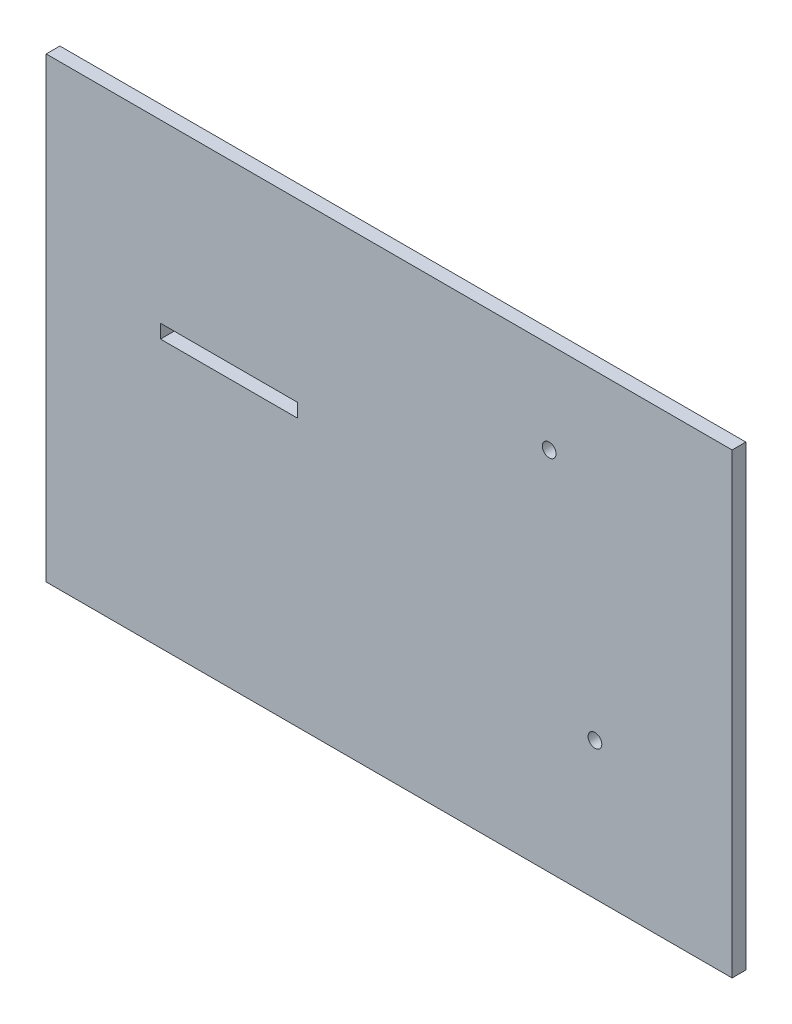
ISO-10303-21;
HEADER;
FILE_DESCRIPTION(('STEP AP214'),'2;1');
FILE_NAME('part.step','',(''),(''),'','','');
FILE_SCHEMA(('AUTOMOTIVE_DESIGN { 1 0 10303 214 1 1 1 1 }'));
ENDSEC;
DATA;
#1=APPLICATION_CONTEXT('core data for automotive mechanical design processes');
#2=APPLICATION_PROTOCOL_DEFINITION('international standard','automotive_design',2000,#1);
#3=PRODUCT_CONTEXT('',#1,'mechanical');
#4=PRODUCT('Part','Part','',(#3));
#5=PRODUCT_RELATED_PRODUCT_CATEGORY('part','',(#4));
#6=PRODUCT_DEFINITION_FORMATION('','',#4);
#7=PRODUCT_DEFINITION_CONTEXT('part definition',#1,'design');
#8=PRODUCT_DEFINITION('design','',#6,#7);
#9=PRODUCT_DEFINITION_SHAPE('','',#8);
#10=(LENGTH_UNIT() NAMED_UNIT(*) SI_UNIT(.MILLI.,.METRE.));
#11=(NAMED_UNIT(*) PLANE_ANGLE_UNIT() SI_UNIT($,.RADIAN.));
#12=(NAMED_UNIT(*) SI_UNIT($,.STERADIAN.) SOLID_ANGLE_UNIT());
#13=UNCERTAINTY_MEASURE_WITH_UNIT(LENGTH_MEASURE(1.E-05),#10,'distance_accuracy_value','');
#14=(GEOMETRIC_REPRESENTATION_CONTEXT(3) GLOBAL_UNCERTAINTY_ASSIGNED_CONTEXT((#13)) GLOBAL_UNIT_ASSIGNED_CONTEXT((#10,
#11,#12)) REPRESENTATION_CONTEXT('',''));
#15=CARTESIAN_POINT('',(0.,0.,0.));
#16=DIRECTION('',(0.,0.,1.));
#17=DIRECTION('',(1.,0.,0.));
#18=AXIS2_PLACEMENT_3D('',#15,#16,#17);
#19=CARTESIAN_POINT('',(0.,0.,3.));
#20=DIRECTION('',(-1.,0.,0.));
#21=DIRECTION('',(0.,-1.,0.));
#22=AXIS2_PLACEMENT_3D('',#19,#20,#21);
#23=PLANE('',#22);
#24=DIRECTION('',(0.,1.,0.));
#25=VECTOR('',#24,1.);
#26=CARTESIAN_POINT('',(0.,0.,0.));
#27=LINE('',#26,#25);
#28=CARTESIAN_POINT('',(0.,0.,0.));
#29=VERTEX_POINT('',#28);
#30=CARTESIAN_POINT('',(0.,100.,0.));
#31=VERTEX_POINT('',#30);
#32=EDGE_CURVE('E137',#29,#31,#27,.T.);
#33=ORIENTED_EDGE('',*,*,#32,.T.);
#34=DIRECTION('',(0.,0.,-1.));
#35=VECTOR('',#34,1.);
#36=CARTESIAN_POINT('',(0.,100.,3.));
#37=LINE('',#36,#35);
#38=CARTESIAN_POINT('',(0.,100.,3.));
#39=VERTEX_POINT('',#38);
#40=EDGE_CURVE('E11',#39,#31,#37,.T.);
#41=ORIENTED_EDGE('',*,*,#40,.F.);
#42=DIRECTION('',(0.,1.,0.));
#43=VECTOR('',#42,1.);
#44=CARTESIAN_POINT('',(0.,0.,3.));
#45=LINE('',#44,#43);
#46=CARTESIAN_POINT('',(0.,0.,3.));
#47=VERTEX_POINT('',#46);
#48=EDGE_CURVE('E146',#47,#39,#45,.T.);
#49=ORIENTED_EDGE('',*,*,#48,.F.);
#50=DIRECTION('',(0.,0.,-1.));
#51=VECTOR('',#50,1.);
#52=CARTESIAN_POINT('',(0.,0.,3.));
#53=LINE('',#52,#51);
#54=EDGE_CURVE('E156',#47,#29,#53,.T.);
#55=ORIENTED_EDGE('',*,*,#54,.T.);
#56=EDGE_LOOP('',(#33,#41,#49,#55));
#57=FACE_BOUND('',#56,.T.);
#58=ADVANCED_FACE('F33',(#57),#23,.F.);
#59=CARTESIAN_POINT('',(0.,100.,3.));
#60=DIRECTION('',(0.,-1.,0.));
#61=DIRECTION('',(1.,0.,0.));
#62=AXIS2_PLACEMENT_3D('',#59,#60,#61);
#63=PLANE('',#62);
#64=DIRECTION('',(-1.,0.,0.));
#65=VECTOR('',#64,1.);
#66=CARTESIAN_POINT('',(0.,100.,0.));
#67=LINE('',#66,#65);
#68=CARTESIAN_POINT('',(-150.,100.,0.));
#69=VERTEX_POINT('',#68);
#70=EDGE_CURVE('E159',#31,#69,#67,.T.);
#71=ORIENTED_EDGE('',*,*,#70,.T.);
#72=DIRECTION('',(0.,0.,-1.));
#73=VECTOR('',#72,1.);
#74=CARTESIAN_POINT('',(-150.,100.,3.));
#75=LINE('',#74,#73);
#76=CARTESIAN_POINT('',(-150.,100.,3.));
#77=VERTEX_POINT('',#76);
#78=EDGE_CURVE('E40',#77,#69,#75,.T.);
#79=ORIENTED_EDGE('',*,*,#78,.F.);
#80=DIRECTION('',(-1.,0.,0.));
#81=VECTOR('',#80,1.);
#82=CARTESIAN_POINT('',(0.,100.,3.));
#83=LINE('',#82,#81);
#84=EDGE_CURVE('E149',#39,#77,#83,.T.);
#85=ORIENTED_EDGE('',*,*,#84,.F.);
#86=ORIENTED_EDGE('',*,*,#40,.T.);
#87=EDGE_LOOP('',(#71,#79,#85,#86));
#88=FACE_BOUND('',#87,.T.);
#89=ADVANCED_FACE('F188',(#88),#63,.F.);
#90=CARTESIAN_POINT('',(-150.,0.,3.));
#91=DIRECTION('',(1.,0.,0.));
#92=DIRECTION('',(0.,0.,-1.));
#93=AXIS2_PLACEMENT_3D('',#90,#91,#92);
#94=PLANE('',#93);
#95=DIRECTION('',(0.,-1.,0.));
#96=VECTOR('',#95,1.);
#97=CARTESIAN_POINT('',(-150.,0.,0.));
#98=LINE('',#97,#96);
#99=CARTESIAN_POINT('',(-150.,0.,0.));
#100=VERTEX_POINT('',#99);
#101=EDGE_CURVE('E161',#69,#100,#98,.T.);
#102=ORIENTED_EDGE('',*,*,#101,.T.);
#103=DIRECTION('',(0.,0.,-1.));
#104=VECTOR('',#103,1.);
#105=CARTESIAN_POINT('',(-150.,0.,3.));
#106=LINE('',#105,#104);
#107=CARTESIAN_POINT('',(-150.,0.,3.));
#108=VERTEX_POINT('',#107);
#109=EDGE_CURVE('E166',#108,#100,#106,.T.);
#110=ORIENTED_EDGE('',*,*,#109,.F.);
#111=DIRECTION('',(0.,-1.,0.));
#112=VECTOR('',#111,1.);
#113=CARTESIAN_POINT('',(-150.,0.,3.));
#114=LINE('',#113,#112);
#115=EDGE_CURVE('E152',#77,#108,#114,.T.);
#116=ORIENTED_EDGE('',*,*,#115,.F.);
#117=ORIENTED_EDGE('',*,*,#78,.T.);
#118=EDGE_LOOP('',(#102,#110,#116,#117));
#119=FACE_BOUND('',#118,.T.);
#120=ADVANCED_FACE('F173',(#119),#94,.F.);
#121=CARTESIAN_POINT('',(0.,0.,3.));
#122=DIRECTION('',(0.,1.,0.));
#123=DIRECTION('',(-1.,0.,0.));
#124=AXIS2_PLACEMENT_3D('',#121,#122,#123);
#125=PLANE('',#124);
#126=DIRECTION('',(1.,0.,0.));
#127=VECTOR('',#126,1.);
#128=CARTESIAN_POINT('',(0.,0.,0.));
#129=LINE('',#128,#127);
#130=EDGE_CURVE('E150',#100,#29,#129,.T.);
#131=ORIENTED_EDGE('',*,*,#130,.T.);
#132=ORIENTED_EDGE('',*,*,#54,.F.);
#133=DIRECTION('',(1.,0.,0.));
#134=VECTOR('',#133,1.);
#135=CARTESIAN_POINT('',(0.,0.,3.));
#136=LINE('',#135,#134);
#137=EDGE_CURVE('E154',#108,#47,#136,.T.);
#138=ORIENTED_EDGE('',*,*,#137,.F.);
#139=ORIENTED_EDGE('',*,*,#109,.T.);
#140=EDGE_LOOP('',(#131,#132,#138,#139));
#141=FACE_BOUND('',#140,.T.);
#142=ADVANCED_FACE('F181',(#141),#125,.F.);
#143=CARTESIAN_POINT('',(0.,0.,3.));
#144=DIRECTION('',(0.,0.,1.));
#145=DIRECTION('',(1.,0.,0.));
#146=AXIS2_PLACEMENT_3D('',#143,#144,#145);
#147=PLANE('',#146);
#148=DIRECTION('',(0.,-1.,0.));
#149=VECTOR('',#148,1.);
#150=CARTESIAN_POINT('',(-125.,58.5,3.));
#151=LINE('',#150,#149);
#152=CARTESIAN_POINT('',(-125.,61.5,3.));
#153=VERTEX_POINT('',#152);
#154=CARTESIAN_POINT('',(-125.,58.5,3.));
#155=VERTEX_POINT('',#154);
#156=EDGE_CURVE('E47',#153,#155,#151,.T.);
#157=ORIENTED_EDGE('',*,*,#156,.F.);
#158=DIRECTION('',(-1.,0.,0.));
#159=VECTOR('',#158,1.);
#160=CARTESIAN_POINT('',(-125.,61.5,3.));
#161=LINE('',#160,#159);
#162=CARTESIAN_POINT('',(-95.,61.5,3.));
#163=VERTEX_POINT('',#162);
#164=EDGE_CURVE('E115',#163,#153,#161,.T.);
#165=ORIENTED_EDGE('',*,*,#164,.F.);
#166=DIRECTION('',(0.,1.,0.));
#167=VECTOR('',#166,1.);
#168=CARTESIAN_POINT('',(-95.,58.5,3.));
#169=LINE('',#168,#167);
#170=CARTESIAN_POINT('',(-95.,58.5,3.));
#171=VERTEX_POINT('',#170);
#172=EDGE_CURVE('E118',#171,#163,#169,.T.);
#173=ORIENTED_EDGE('',*,*,#172,.F.);
#174=DIRECTION('',(1.,0.,0.));
#175=VECTOR('',#174,1.);
#176=CARTESIAN_POINT('',(-125.,58.5,3.));
#177=LINE('',#176,#175);
#178=EDGE_CURVE('E124',#155,#171,#177,.T.);
#179=ORIENTED_EDGE('',*,*,#178,.F.);
#180=EDGE_LOOP('',(#157,#165,#173,#179));
#181=FACE_BOUND('',#180,.T.);
#182=CARTESIAN_POINT('',(-30.,30.,3.));
#183=DIRECTION('',(0.,0.,1.));
#184=DIRECTION('',(1.,0.,0.));
#185=AXIS2_PLACEMENT_3D('',#182,#183,#184);
#186=CIRCLE('',#185,1.5);
#187=CARTESIAN_POINT('',(-28.5,30.,3.));
#188=VERTEX_POINT('',#187);
#189=EDGE_CURVE('E138',#188,#188,#186,.T.);
#190=ORIENTED_EDGE('',*,*,#189,.F.);
#191=EDGE_LOOP('',(#190));
#192=FACE_BOUND('',#191,.T.);
#193=CARTESIAN_POINT('',(-40.,80.,3.));
#194=DIRECTION('',(0.,0.,1.));
#195=DIRECTION('',(1.,0.,0.));
#196=AXIS2_PLACEMENT_3D('',#193,#194,#195);
#197=CIRCLE('',#196,1.5);
#198=CARTESIAN_POINT('',(-38.5,80.,3.));
#199=VERTEX_POINT('',#198);
#200=EDGE_CURVE('E130',#199,#199,#197,.T.);
#201=ORIENTED_EDGE('',*,*,#200,.F.);
#202=EDGE_LOOP('',(#201));
#203=FACE_BOUND('',#202,.T.);
#204=ORIENTED_EDGE('',*,*,#48,.T.);
#205=ORIENTED_EDGE('',*,*,#84,.T.);
#206=ORIENTED_EDGE('',*,*,#115,.T.);
#207=ORIENTED_EDGE('',*,*,#137,.T.);
#208=EDGE_LOOP('',(#204,#205,#206,#207));
#209=FACE_BOUND('',#208,.T.);
#210=ADVANCED_FACE('F187',(#181,#192,#203,#209),#147,.T.);
#211=CARTESIAN_POINT('',(0.,0.,0.));
#212=DIRECTION('',(0.,0.,1.));
#213=DIRECTION('',(1.,0.,0.));
#214=AXIS2_PLACEMENT_3D('',#211,#212,#213);
#215=PLANE('',#214);
#216=DIRECTION('',(-1.,0.,0.));
#217=VECTOR('',#216,1.);
#218=CARTESIAN_POINT('',(-125.,61.5,0.));
#219=LINE('',#218,#217);
#220=CARTESIAN_POINT('',(-95.,61.5,0.));
#221=VERTEX_POINT('',#220);
#222=CARTESIAN_POINT('',(-125.,61.5,0.));
#223=VERTEX_POINT('',#222);
#224=EDGE_CURVE('E105',#221,#223,#219,.T.);
#225=ORIENTED_EDGE('',*,*,#224,.T.);
#226=DIRECTION('',(0.,-1.,0.));
#227=VECTOR('',#226,1.);
#228=CARTESIAN_POINT('',(-125.,58.5,0.));
#229=LINE('',#228,#227);
#230=CARTESIAN_POINT('',(-125.,58.5,0.));
#231=VERTEX_POINT('',#230);
#232=EDGE_CURVE('E99',#223,#231,#229,.T.);
#233=ORIENTED_EDGE('',*,*,#232,.T.);
#234=DIRECTION('',(1.,0.,0.));
#235=VECTOR('',#234,1.);
#236=CARTESIAN_POINT('',(-125.,58.5,0.));
#237=LINE('',#236,#235);
#238=CARTESIAN_POINT('',(-95.,58.5,0.));
#239=VERTEX_POINT('',#238);
#240=EDGE_CURVE('E108',#231,#239,#237,.T.);
#241=ORIENTED_EDGE('',*,*,#240,.T.);
#242=DIRECTION('',(0.,1.,0.));
#243=VECTOR('',#242,1.);
#244=CARTESIAN_POINT('',(-95.,58.5,0.));
#245=LINE('',#244,#243);
#246=EDGE_CURVE('E55',#239,#221,#245,.T.);
#247=ORIENTED_EDGE('',*,*,#246,.T.);
#248=EDGE_LOOP('',(#225,#233,#241,#247));
#249=FACE_BOUND('',#248,.T.);
#250=CARTESIAN_POINT('',(-30.,30.,0.));
#251=DIRECTION('',(0.,0.,1.));
#252=DIRECTION('',(1.,0.,0.));
#253=AXIS2_PLACEMENT_3D('',#250,#251,#252);
#254=CIRCLE('',#253,1.5);
#255=CARTESIAN_POINT('',(-28.5,30.,0.));
#256=VERTEX_POINT('',#255);
#257=EDGE_CURVE('E134',#256,#256,#254,.T.);
#258=ORIENTED_EDGE('',*,*,#257,.T.);
#259=EDGE_LOOP('',(#258));
#260=FACE_BOUND('',#259,.T.);
#261=CARTESIAN_POINT('',(-40.,80.,0.));
#262=DIRECTION('',(0.,0.,1.));
#263=DIRECTION('',(1.,0.,0.));
#264=AXIS2_PLACEMENT_3D('',#261,#262,#263);
#265=CIRCLE('',#264,1.5);
#266=CARTESIAN_POINT('',(-38.5,80.,0.));
#267=VERTEX_POINT('',#266);
#268=EDGE_CURVE('E141',#267,#267,#265,.T.);
#269=ORIENTED_EDGE('',*,*,#268,.T.);
#270=EDGE_LOOP('',(#269));
#271=FACE_BOUND('',#270,.T.);
#272=ORIENTED_EDGE('',*,*,#32,.F.);
#273=ORIENTED_EDGE('',*,*,#130,.F.);
#274=ORIENTED_EDGE('',*,*,#101,.F.);
#275=ORIENTED_EDGE('',*,*,#70,.F.);
#276=EDGE_LOOP('',(#272,#273,#274,#275));
#277=FACE_BOUND('',#276,.T.);
#278=ADVANCED_FACE('F112',(#249,#260,#271,#277),#215,.F.);
#279=CARTESIAN_POINT('',(-40.,80.,0.));
#280=DIRECTION('',(0.,0.,1.));
#281=DIRECTION('',(1.,0.,0.));
#282=AXIS2_PLACEMENT_3D('',#279,#280,#281);
#283=CYLINDRICAL_SURFACE('',#282,1.5);
#284=ORIENTED_EDGE('',*,*,#268,.F.);
#285=EDGE_LOOP('',(#284));
#286=FACE_BOUND('',#285,.T.);
#287=ORIENTED_EDGE('',*,*,#200,.T.);
#288=EDGE_LOOP('',(#287));
#289=FACE_BOUND('',#288,.T.);
#290=ADVANCED_FACE('F200',(#286,#289),#283,.F.);
#291=CARTESIAN_POINT('',(-30.,30.,0.));
#292=DIRECTION('',(0.,0.,1.));
#293=DIRECTION('',(1.,0.,0.));
#294=AXIS2_PLACEMENT_3D('',#291,#292,#293);
#295=CYLINDRICAL_SURFACE('',#294,1.5);
#296=ORIENTED_EDGE('',*,*,#257,.F.);
#297=EDGE_LOOP('',(#296));
#298=FACE_BOUND('',#297,.T.);
#299=ORIENTED_EDGE('',*,*,#189,.T.);
#300=EDGE_LOOP('',(#299));
#301=FACE_BOUND('',#300,.T.);
#302=ADVANCED_FACE('F206',(#298,#301),#295,.F.);
#303=CARTESIAN_POINT('',(-125.,58.5,0.));
#304=DIRECTION('',(-1.,0.,0.));
#305=DIRECTION('',(0.,0.,1.));
#306=AXIS2_PLACEMENT_3D('',#303,#304,#305);
#307=PLANE('',#306);
#308=ORIENTED_EDGE('',*,*,#156,.T.);
#309=DIRECTION('',(0.,0.,1.));
#310=VECTOR('',#309,1.);
#311=CARTESIAN_POINT('',(-125.,58.5,0.));
#312=LINE('',#311,#310);
#313=EDGE_CURVE('E95',#231,#155,#312,.T.);
#314=ORIENTED_EDGE('',*,*,#313,.F.);
#315=ORIENTED_EDGE('',*,*,#232,.F.);
#316=DIRECTION('',(0.,0.,1.));
#317=VECTOR('',#316,1.);
#318=CARTESIAN_POINT('',(-125.,61.5,0.));
#319=LINE('',#318,#317);
#320=EDGE_CURVE('E128',#223,#153,#319,.T.);
#321=ORIENTED_EDGE('',*,*,#320,.T.);
#322=EDGE_LOOP('',(#308,#314,#315,#321));
#323=FACE_BOUND('',#322,.T.);
#324=ADVANCED_FACE('F97',(#323),#307,.F.);
#325=CARTESIAN_POINT('',(-125.,61.5,0.));
#326=DIRECTION('',(0.,1.,0.));
#327=DIRECTION('',(-1.,0.,0.));
#328=AXIS2_PLACEMENT_3D('',#325,#326,#327);
#329=PLANE('',#328);
#330=ORIENTED_EDGE('',*,*,#164,.T.);
#331=ORIENTED_EDGE('',*,*,#320,.F.);
#332=ORIENTED_EDGE('',*,*,#224,.F.);
#333=DIRECTION('',(0.,0.,1.));
#334=VECTOR('',#333,1.);
#335=CARTESIAN_POINT('',(-95.,61.5,0.));
#336=LINE('',#335,#334);
#337=EDGE_CURVE('E131',#221,#163,#336,.T.);
#338=ORIENTED_EDGE('',*,*,#337,.T.);
#339=EDGE_LOOP('',(#330,#331,#332,#338));
#340=FACE_BOUND('',#339,.T.);
#341=ADVANCED_FACE('F213',(#340),#329,.F.);
#342=CARTESIAN_POINT('',(-95.,58.5,0.));
#343=DIRECTION('',(1.,0.,0.));
#344=DIRECTION('',(0.,0.,-1.));
#345=AXIS2_PLACEMENT_3D('',#342,#343,#344);
#346=PLANE('',#345);
#347=ORIENTED_EDGE('',*,*,#172,.T.);
#348=ORIENTED_EDGE('',*,*,#337,.F.);
#349=ORIENTED_EDGE('',*,*,#246,.F.);
#350=DIRECTION('',(0.,0.,1.));
#351=VECTOR('',#350,1.);
#352=CARTESIAN_POINT('',(-95.,58.5,0.));
#353=LINE('',#352,#351);
#354=EDGE_CURVE('E104',#239,#171,#353,.T.);
#355=ORIENTED_EDGE('',*,*,#354,.T.);
#356=EDGE_LOOP('',(#347,#348,#349,#355));
#357=FACE_BOUND('',#356,.T.);
#358=ADVANCED_FACE('F216',(#357),#346,.F.);
#359=CARTESIAN_POINT('',(-125.,58.5,0.));
#360=DIRECTION('',(0.,-1.,0.));
#361=DIRECTION('',(1.,0.,0.));
#362=AXIS2_PLACEMENT_3D('',#359,#360,#361);
#363=PLANE('',#362);
#364=ORIENTED_EDGE('',*,*,#178,.T.);
#365=ORIENTED_EDGE('',*,*,#354,.F.);
#366=ORIENTED_EDGE('',*,*,#240,.F.);
#367=ORIENTED_EDGE('',*,*,#313,.T.);
#368=EDGE_LOOP('',(#364,#365,#366,#367));
#369=FACE_BOUND('',#368,.T.);
#370=ADVANCED_FACE('F109',(#369),#363,.F.);
#371=CLOSED_SHELL('',(#58,#89,#120,#142,#210,#278,#290,#302,#324,#341,#358,#370));
#372=MANIFOLD_SOLID_BREP('B2',#371);
#373=ADVANCED_BREP_SHAPE_REPRESENTATION('',(#18,#372),#14);
#374=SHAPE_DEFINITION_REPRESENTATION(#9,#373);
ENDSEC;
END-ISO-10303-21;
